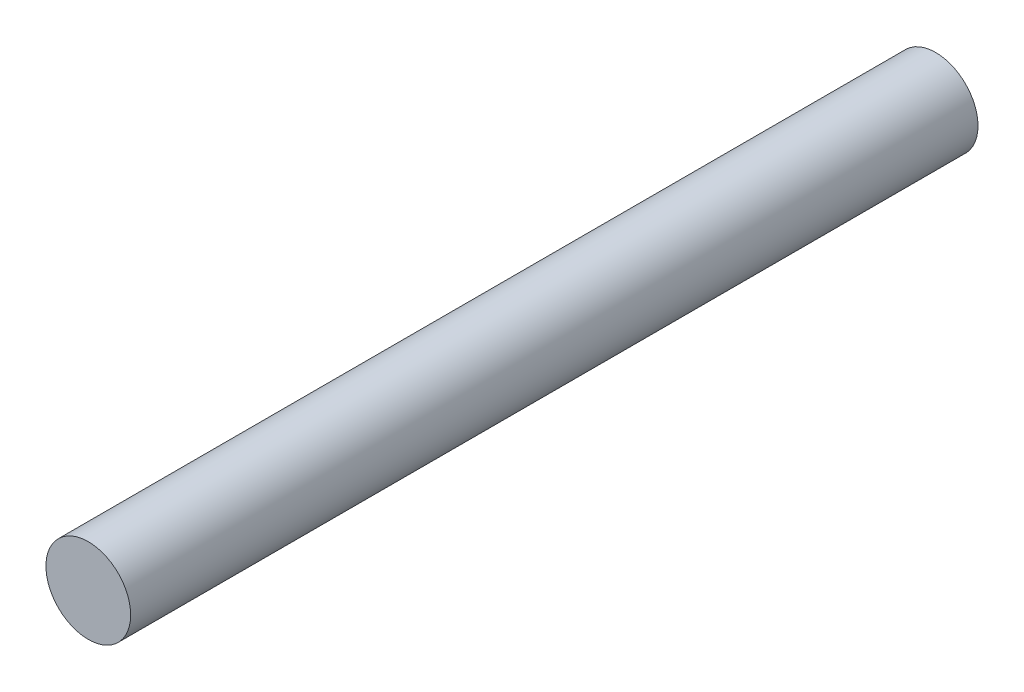
ISO-10303-21;
HEADER;
FILE_DESCRIPTION(('STEP AP214'),'2;1');
FILE_NAME('part.step','',(''),(''),'','','');
FILE_SCHEMA(('AUTOMOTIVE_DESIGN { 1 0 10303 214 1 1 1 1 }'));
ENDSEC;
DATA;
#1=APPLICATION_CONTEXT('core data for automotive mechanical design processes');
#2=APPLICATION_PROTOCOL_DEFINITION('international standard','automotive_design',2000,#1);
#3=PRODUCT_CONTEXT('',#1,'mechanical');
#4=PRODUCT('Part','Part','',(#3));
#5=PRODUCT_RELATED_PRODUCT_CATEGORY('part','',(#4));
#6=PRODUCT_DEFINITION_FORMATION('','',#4);
#7=PRODUCT_DEFINITION_CONTEXT('part definition',#1,'design');
#8=PRODUCT_DEFINITION('design','',#6,#7);
#9=PRODUCT_DEFINITION_SHAPE('','',#8);
#10=(LENGTH_UNIT() NAMED_UNIT(*) SI_UNIT(.MILLI.,.METRE.));
#11=(NAMED_UNIT(*) PLANE_ANGLE_UNIT() SI_UNIT($,.RADIAN.));
#12=(NAMED_UNIT(*) SI_UNIT($,.STERADIAN.) SOLID_ANGLE_UNIT());
#13=UNCERTAINTY_MEASURE_WITH_UNIT(LENGTH_MEASURE(1.E-05),#10,'distance_accuracy_value','');
#14=(GEOMETRIC_REPRESENTATION_CONTEXT(3) GLOBAL_UNCERTAINTY_ASSIGNED_CONTEXT((#13)) GLOBAL_UNIT_ASSIGNED_CONTEXT((#10,
#11,#12)) REPRESENTATION_CONTEXT('',''));
#15=CARTESIAN_POINT('',(0.,0.,0.));
#16=DIRECTION('',(0.,0.,1.));
#17=DIRECTION('',(1.,0.,0.));
#18=AXIS2_PLACEMENT_3D('',#15,#16,#17);
#19=CARTESIAN_POINT('',(0.,0.,30.));
#20=DIRECTION('',(0.,0.,-1.));
#21=DIRECTION('',(-1.,0.,0.));
#22=AXIS2_PLACEMENT_3D('',#19,#20,#21);
#23=CYLINDRICAL_SURFACE('',#22,1.5);
#24=CARTESIAN_POINT('',(0.,0.,30.));
#25=DIRECTION('',(0.,0.,1.));
#26=DIRECTION('',(1.,0.,0.));
#27=AXIS2_PLACEMENT_3D('',#24,#25,#26);
#28=CIRCLE('',#27,1.5);
#29=CARTESIAN_POINT('',(1.5,0.,30.));
#30=VERTEX_POINT('',#29);
#31=EDGE_CURVE('E10',#30,#30,#28,.T.);
#32=ORIENTED_EDGE('',*,*,#31,.F.);
#33=EDGE_LOOP('',(#32));
#34=FACE_BOUND('',#33,.T.);
#35=CARTESIAN_POINT('',(0.,0.,0.));
#36=DIRECTION('',(0.,0.,1.));
#37=DIRECTION('',(1.,0.,0.));
#38=AXIS2_PLACEMENT_3D('',#35,#36,#37);
#39=CIRCLE('',#38,1.5);
#40=CARTESIAN_POINT('',(1.5,0.,0.));
#41=VERTEX_POINT('',#40);
#42=EDGE_CURVE('E44',#41,#41,#39,.T.);
#43=ORIENTED_EDGE('',*,*,#42,.T.);
#44=EDGE_LOOP('',(#43));
#45=FACE_BOUND('',#44,.T.);
#46=ADVANCED_FACE('F41',(#34,#45),#23,.T.);
#47=CARTESIAN_POINT('',(0.,0.,30.));
#48=DIRECTION('',(0.,0.,1.));
#49=DIRECTION('',(1.,0.,0.));
#50=AXIS2_PLACEMENT_3D('',#47,#48,#49);
#51=PLANE('',#50);
#52=ORIENTED_EDGE('',*,*,#31,.T.);
#53=EDGE_LOOP('',(#52));
#54=FACE_BOUND('',#53,.T.);
#55=ADVANCED_FACE('F58',(#54),#51,.T.);
#56=CARTESIAN_POINT('',(0.,0.,0.));
#57=DIRECTION('',(0.,0.,1.));
#58=DIRECTION('',(1.,0.,0.));
#59=AXIS2_PLACEMENT_3D('',#56,#57,#58);
#60=PLANE('',#59);
#61=ORIENTED_EDGE('',*,*,#42,.F.);
#62=EDGE_LOOP('',(#61));
#63=FACE_BOUND('',#62,.T.);
#64=ADVANCED_FACE('F56',(#63),#60,.F.);
#65=CLOSED_SHELL('',(#46,#55,#64));
#66=MANIFOLD_SOLID_BREP('B2',#65);
#67=ADVANCED_BREP_SHAPE_REPRESENTATION('',(#18,#66),#14);
#68=SHAPE_DEFINITION_REPRESENTATION(#9,#67);
ENDSEC;
END-ISO-10303-21;
